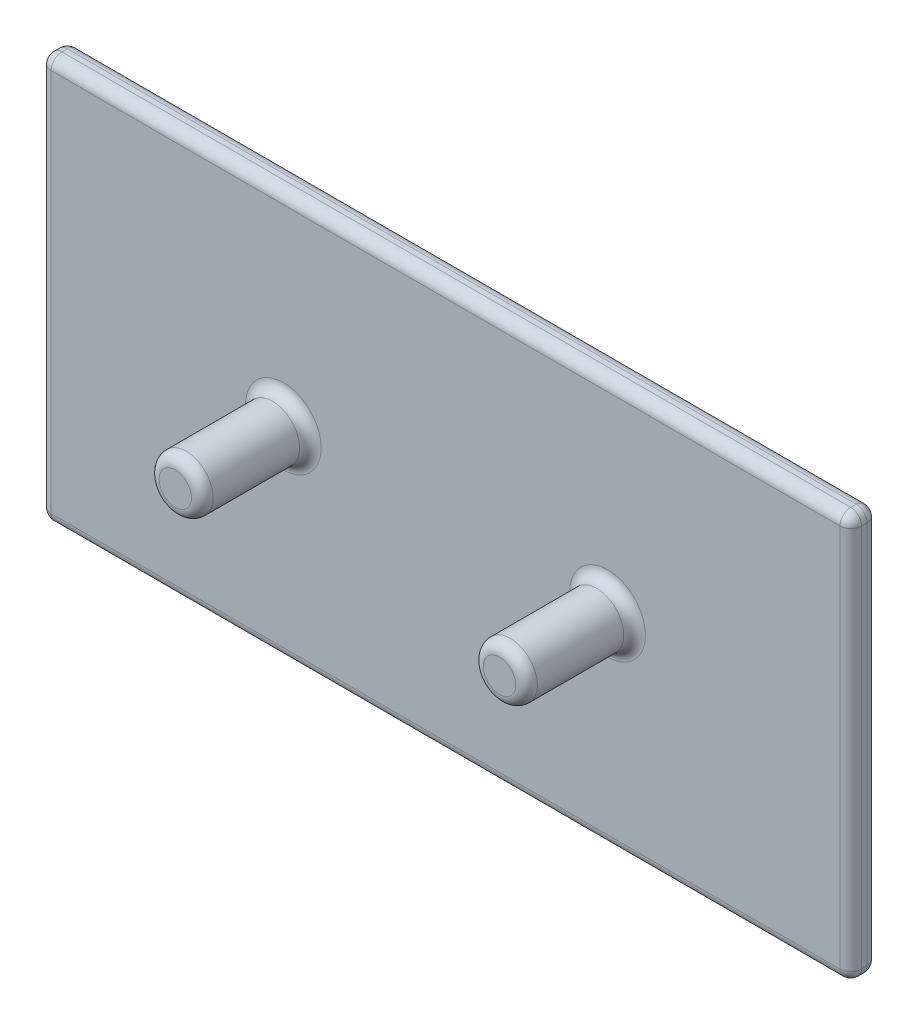
ISO-10303-21;
HEADER;
FILE_DESCRIPTION(('STEP AP214'),'2;1');
FILE_NAME('part.step','',(''),(''),'','','');
FILE_SCHEMA(('AUTOMOTIVE_DESIGN { 1 0 10303 214 1 1 1 1 }'));
ENDSEC;
DATA;
#1=APPLICATION_CONTEXT('core data for automotive mechanical design processes');
#2=APPLICATION_PROTOCOL_DEFINITION('international standard','automotive_design',2000,#1);
#3=PRODUCT_CONTEXT('',#1,'mechanical');
#4=PRODUCT('Part','Part','',(#3));
#5=PRODUCT_RELATED_PRODUCT_CATEGORY('part','',(#4));
#6=PRODUCT_DEFINITION_FORMATION('','',#4);
#7=PRODUCT_DEFINITION_CONTEXT('part definition',#1,'design');
#8=PRODUCT_DEFINITION('design','',#6,#7);
#9=PRODUCT_DEFINITION_SHAPE('','',#8);
#10=(LENGTH_UNIT() NAMED_UNIT(*) SI_UNIT(.MILLI.,.METRE.));
#11=(NAMED_UNIT(*) PLANE_ANGLE_UNIT() SI_UNIT($,.RADIAN.));
#12=(NAMED_UNIT(*) SI_UNIT($,.STERADIAN.) SOLID_ANGLE_UNIT());
#13=UNCERTAINTY_MEASURE_WITH_UNIT(LENGTH_MEASURE(1.E-05),#10,'distance_accuracy_value','');
#14=(GEOMETRIC_REPRESENTATION_CONTEXT(3) GLOBAL_UNCERTAINTY_ASSIGNED_CONTEXT((#13)) GLOBAL_UNIT_ASSIGNED_CONTEXT((#10,
#11,#12)) REPRESENTATION_CONTEXT('',''));
#15=CARTESIAN_POINT('',(0.,0.,0.));
#16=DIRECTION('',(0.,0.,1.));
#17=DIRECTION('',(1.,0.,0.));
#18=AXIS2_PLACEMENT_3D('',#15,#16,#17);
#19=CARTESIAN_POINT('',(0.,0.,10.));
#20=DIRECTION('',(1.,0.,0.));
#21=DIRECTION('',(0.,0.,-1.));
#22=AXIS2_PLACEMENT_3D('',#19,#20,#21);
#23=PLANE('',#22);
#24=DIRECTION('',(0.,0.,-1.));
#25=VECTOR('',#24,1.);
#26=CARTESIAN_POINT('',(0.,4.,10.));
#27=LINE('',#26,#25);
#28=CARTESIAN_POINT('',(0.,4.,4.));
#29=VERTEX_POINT('',#28);
#30=CARTESIAN_POINT('',(0.,4.,6.));
#31=VERTEX_POINT('',#30);
#32=EDGE_CURVE('E249',#29,#31,#27,.F.);
#33=ORIENTED_EDGE('',*,*,#32,.T.);
#34=DIRECTION('',(0.,-1.,0.));
#35=VECTOR('',#34,1.);
#36=CARTESIAN_POINT('',(0.,0.,6.));
#37=LINE('',#36,#35);
#38=CARTESIAN_POINT('',(0.,146.,6.));
#39=VERTEX_POINT('',#38);
#40=EDGE_CURVE('E251',#31,#39,#37,.F.);
#41=ORIENTED_EDGE('',*,*,#40,.T.);
#42=DIRECTION('',(0.,0.,-1.));
#43=VECTOR('',#42,1.);
#44=CARTESIAN_POINT('',(0.,146.,10.));
#45=LINE('',#44,#43);
#46=CARTESIAN_POINT('',(0.,146.,4.));
#47=VERTEX_POINT('',#46);
#48=EDGE_CURVE('E245',#39,#47,#45,.T.);
#49=ORIENTED_EDGE('',*,*,#48,.T.);
#50=DIRECTION('',(0.,-1.,0.));
#51=VECTOR('',#50,1.);
#52=CARTESIAN_POINT('',(0.,0.,4.));
#53=LINE('',#52,#51);
#54=EDGE_CURVE('E247',#47,#29,#53,.T.);
#55=ORIENTED_EDGE('',*,*,#54,.T.);
#56=EDGE_LOOP('',(#33,#41,#49,#55));
#57=FACE_BOUND('',#56,.T.);
#58=ADVANCED_FACE('F33',(#57),#23,.F.);
#59=CARTESIAN_POINT('',(0.,0.,10.));
#60=DIRECTION('',(0.,1.,0.));
#61=DIRECTION('',(0.,0.,1.));
#62=AXIS2_PLACEMENT_3D('',#59,#60,#61);
#63=PLANE('',#62);
#64=DIRECTION('',(1.,0.,0.));
#65=VECTOR('',#64,1.);
#66=CARTESIAN_POINT('',(0.,0.,6.));
#67=LINE('',#66,#65);
#68=CARTESIAN_POINT('',(296.,0.,6.));
#69=VERTEX_POINT('',#68);
#70=CARTESIAN_POINT('',(4.,0.,6.));
#71=VERTEX_POINT('',#70);
#72=EDGE_CURVE('E231',#69,#71,#67,.F.);
#73=ORIENTED_EDGE('',*,*,#72,.T.);
#74=DIRECTION('',(0.,0.,-1.));
#75=VECTOR('',#74,1.);
#76=CARTESIAN_POINT('',(4.,0.,10.));
#77=LINE('',#76,#75);
#78=CARTESIAN_POINT('',(4.,0.,4.));
#79=VERTEX_POINT('',#78);
#80=EDGE_CURVE('E234',#71,#79,#77,.T.);
#81=ORIENTED_EDGE('',*,*,#80,.T.);
#82=DIRECTION('',(1.,0.,0.));
#83=VECTOR('',#82,1.);
#84=CARTESIAN_POINT('',(300.,0.,4.));
#85=LINE('',#84,#83);
#86=CARTESIAN_POINT('',(296.,0.,4.));
#87=VERTEX_POINT('',#86);
#88=EDGE_CURVE('E229',#79,#87,#85,.T.);
#89=ORIENTED_EDGE('',*,*,#88,.T.);
#90=DIRECTION('',(0.,0.,-1.));
#91=VECTOR('',#90,1.);
#92=CARTESIAN_POINT('',(296.,0.,10.));
#93=LINE('',#92,#91);
#94=EDGE_CURVE('E227',#87,#69,#93,.F.);
#95=ORIENTED_EDGE('',*,*,#94,.T.);
#96=EDGE_LOOP('',(#73,#81,#89,#95));
#97=FACE_BOUND('',#96,.T.);
#98=ADVANCED_FACE('F296',(#97),#63,.F.);
#99=CARTESIAN_POINT('',(300.,0.,10.));
#100=DIRECTION('',(-1.,0.,0.));
#101=DIRECTION('',(0.,0.,1.));
#102=AXIS2_PLACEMENT_3D('',#99,#100,#101);
#103=PLANE('',#102);
#104=DIRECTION('',(0.,1.,0.));
#105=VECTOR('',#104,1.);
#106=CARTESIAN_POINT('',(300.,0.,6.));
#107=LINE('',#106,#105);
#108=CARTESIAN_POINT('',(300.,146.,6.));
#109=VERTEX_POINT('',#108);
#110=CARTESIAN_POINT('',(300.,4.,6.));
#111=VERTEX_POINT('',#110);
#112=EDGE_CURVE('E155',#109,#111,#107,.F.);
#113=ORIENTED_EDGE('',*,*,#112,.T.);
#114=DIRECTION('',(0.,0.,-1.));
#115=VECTOR('',#114,1.);
#116=CARTESIAN_POINT('',(300.,4.,10.));
#117=LINE('',#116,#115);
#118=CARTESIAN_POINT('',(300.,4.,4.));
#119=VERTEX_POINT('',#118);
#120=EDGE_CURVE('E259',#111,#119,#117,.T.);
#121=ORIENTED_EDGE('',*,*,#120,.T.);
#122=DIRECTION('',(0.,1.,0.));
#123=VECTOR('',#122,1.);
#124=CARTESIAN_POINT('',(300.,150.,4.));
#125=LINE('',#124,#123);
#126=CARTESIAN_POINT('',(300.,146.,4.));
#127=VERTEX_POINT('',#126);
#128=EDGE_CURVE('E256',#119,#127,#125,.T.);
#129=ORIENTED_EDGE('',*,*,#128,.T.);
#130=DIRECTION('',(0.,0.,-1.));
#131=VECTOR('',#130,1.);
#132=CARTESIAN_POINT('',(300.,146.,10.));
#133=LINE('',#132,#131);
#134=EDGE_CURVE('E254',#127,#109,#133,.F.);
#135=ORIENTED_EDGE('',*,*,#134,.T.);
#136=EDGE_LOOP('',(#113,#121,#129,#135));
#137=FACE_BOUND('',#136,.T.);
#138=ADVANCED_FACE('F309',(#137),#103,.F.);
#139=CARTESIAN_POINT('',(0.,150.,10.));
#140=DIRECTION('',(0.,-1.,0.));
#141=DIRECTION('',(0.,0.,-1.));
#142=AXIS2_PLACEMENT_3D('',#139,#140,#141);
#143=PLANE('',#142);
#144=DIRECTION('',(-1.,0.,0.));
#145=VECTOR('',#144,1.);
#146=CARTESIAN_POINT('',(0.,150.,6.));
#147=LINE('',#146,#145);
#148=CARTESIAN_POINT('',(4.,150.,6.));
#149=VERTEX_POINT('',#148);
#150=CARTESIAN_POINT('',(296.,150.,6.));
#151=VERTEX_POINT('',#150);
#152=EDGE_CURVE('E50',#149,#151,#147,.F.);
#153=ORIENTED_EDGE('',*,*,#152,.T.);
#154=DIRECTION('',(0.,0.,-1.));
#155=VECTOR('',#154,1.);
#156=CARTESIAN_POINT('',(296.,150.,10.));
#157=LINE('',#156,#155);
#158=CARTESIAN_POINT('',(296.,150.,4.));
#159=VERTEX_POINT('',#158);
#160=EDGE_CURVE('E266',#151,#159,#157,.T.);
#161=ORIENTED_EDGE('',*,*,#160,.T.);
#162=DIRECTION('',(-1.,0.,0.));
#163=VECTOR('',#162,1.);
#164=CARTESIAN_POINT('',(0.,150.,4.));
#165=LINE('',#164,#163);
#166=CARTESIAN_POINT('',(4.,150.,4.));
#167=VERTEX_POINT('',#166);
#168=EDGE_CURVE('E262',#159,#167,#165,.T.);
#169=ORIENTED_EDGE('',*,*,#168,.T.);
#170=DIRECTION('',(0.,0.,-1.));
#171=VECTOR('',#170,1.);
#172=CARTESIAN_POINT('',(4.,150.,10.));
#173=LINE('',#172,#171);
#174=EDGE_CURVE('E55',#167,#149,#173,.F.);
#175=ORIENTED_EDGE('',*,*,#174,.T.);
#176=EDGE_LOOP('',(#153,#161,#169,#175));
#177=FACE_BOUND('',#176,.T.);
#178=ADVANCED_FACE('F314',(#177),#143,.F.);
#179=CARTESIAN_POINT('',(0.,0.,10.));
#180=DIRECTION('',(0.,0.,-1.));
#181=DIRECTION('',(-1.,0.,0.));
#182=AXIS2_PLACEMENT_3D('',#179,#180,#181);
#183=PLANE('',#182);
#184=CARTESIAN_POINT('',(90.,75.,10.));
#185=DIRECTION('',(0.,0.,-1.));
#186=DIRECTION('',(-1.,0.,0.));
#187=AXIS2_PLACEMENT_3D('',#184,#185,#186);
#188=CIRCLE('',#187,14.);
#189=CARTESIAN_POINT('',(76.,75.,10.));
#190=VERTEX_POINT('',#189);
#191=EDGE_CURVE('E218',#190,#190,#188,.T.);
#192=ORIENTED_EDGE('',*,*,#191,.T.);
#193=EDGE_LOOP('',(#192));
#194=FACE_BOUND('',#193,.T.);
#195=CARTESIAN_POINT('',(210.,75.,10.));
#196=DIRECTION('',(0.,0.,-1.));
#197=DIRECTION('',(-1.,0.,0.));
#198=AXIS2_PLACEMENT_3D('',#195,#196,#197);
#199=CIRCLE('',#198,14.);
#200=CARTESIAN_POINT('',(196.,75.,10.));
#201=VERTEX_POINT('',#200);
#202=EDGE_CURVE('E215',#201,#201,#199,.T.);
#203=ORIENTED_EDGE('',*,*,#202,.T.);
#204=EDGE_LOOP('',(#203));
#205=FACE_BOUND('',#204,.T.);
#206=DIRECTION('',(0.,-1.,0.));
#207=VECTOR('',#206,1.);
#208=CARTESIAN_POINT('',(4.,0.,10.));
#209=LINE('',#208,#207);
#210=CARTESIAN_POINT('',(4.,146.,10.));
#211=VERTEX_POINT('',#210);
#212=CARTESIAN_POINT('',(4.,4.,10.));
#213=VERTEX_POINT('',#212);
#214=EDGE_CURVE('E133',#211,#213,#209,.T.);
#215=ORIENTED_EDGE('',*,*,#214,.T.);
#216=DIRECTION('',(1.,0.,0.));
#217=VECTOR('',#216,1.);
#218=CARTESIAN_POINT('',(0.,4.,10.));
#219=LINE('',#218,#217);
#220=CARTESIAN_POINT('',(296.,4.,10.));
#221=VERTEX_POINT('',#220);
#222=EDGE_CURVE('E129',#213,#221,#219,.T.);
#223=ORIENTED_EDGE('',*,*,#222,.T.);
#224=DIRECTION('',(0.,1.,0.));
#225=VECTOR('',#224,1.);
#226=CARTESIAN_POINT('',(296.,0.,10.));
#227=LINE('',#226,#225);
#228=CARTESIAN_POINT('',(296.,146.,10.));
#229=VERTEX_POINT('',#228);
#230=EDGE_CURVE('E123',#221,#229,#227,.T.);
#231=ORIENTED_EDGE('',*,*,#230,.T.);
#232=DIRECTION('',(-1.,0.,0.));
#233=VECTOR('',#232,1.);
#234=CARTESIAN_POINT('',(0.,146.,10.));
#235=LINE('',#234,#233);
#236=EDGE_CURVE('E126',#229,#211,#235,.T.);
#237=ORIENTED_EDGE('',*,*,#236,.T.);
#238=EDGE_LOOP('',(#215,#223,#231,#237));
#239=FACE_BOUND('',#238,.T.);
#240=ADVANCED_FACE('F125',(#194,#205,#239),#183,.F.);
#241=CARTESIAN_POINT('',(0.,0.,0.));
#242=DIRECTION('',(0.,0.,-1.));
#243=DIRECTION('',(-1.,0.,0.));
#244=AXIS2_PLACEMENT_3D('',#241,#242,#243);
#245=PLANE('',#244);
#246=DIRECTION('',(0.,1.,0.));
#247=VECTOR('',#246,1.);
#248=CARTESIAN_POINT('',(296.,0.,0.));
#249=LINE('',#248,#247);
#250=CARTESIAN_POINT('',(296.,146.,0.));
#251=VERTEX_POINT('',#250);
#252=CARTESIAN_POINT('',(296.,4.,0.));
#253=VERTEX_POINT('',#252);
#254=EDGE_CURVE('E238',#251,#253,#249,.F.);
#255=ORIENTED_EDGE('',*,*,#254,.T.);
#256=DIRECTION('',(1.,0.,0.));
#257=VECTOR('',#256,1.);
#258=CARTESIAN_POINT('',(0.,4.,0.));
#259=LINE('',#258,#257);
#260=CARTESIAN_POINT('',(4.,4.,0.));
#261=VERTEX_POINT('',#260);
#262=EDGE_CURVE('E242',#253,#261,#259,.F.);
#263=ORIENTED_EDGE('',*,*,#262,.T.);
#264=DIRECTION('',(0.,-1.,0.));
#265=VECTOR('',#264,1.);
#266=CARTESIAN_POINT('',(4.,150.,0.));
#267=LINE('',#266,#265);
#268=CARTESIAN_POINT('',(4.,146.,0.));
#269=VERTEX_POINT('',#268);
#270=EDGE_CURVE('E240',#261,#269,#267,.F.);
#271=ORIENTED_EDGE('',*,*,#270,.T.);
#272=DIRECTION('',(-1.,0.,0.));
#273=VECTOR('',#272,1.);
#274=CARTESIAN_POINT('',(300.,146.,0.));
#275=LINE('',#274,#273);
#276=EDGE_CURVE('E236',#269,#251,#275,.F.);
#277=ORIENTED_EDGE('',*,*,#276,.T.);
#278=EDGE_LOOP('',(#255,#263,#271,#277));
#279=FACE_BOUND('',#278,.T.);
#280=ADVANCED_FACE('F583',(#279),#245,.T.);
#281=CARTESIAN_POINT('',(90.,75.,50.));
#282=DIRECTION('',(0.,0.,-1.));
#283=DIRECTION('',(-1.,0.,0.));
#284=AXIS2_PLACEMENT_3D('',#281,#282,#283);
#285=CYLINDRICAL_SURFACE('',#284,9.99999999999999);
#286=CARTESIAN_POINT('',(90.,75.,14.));
#287=DIRECTION('',(0.,0.,-1.));
#288=DIRECTION('',(-1.,0.,0.));
#289=AXIS2_PLACEMENT_3D('',#286,#287,#288);
#290=CIRCLE('',#289,9.99999999999999);
#291=CARTESIAN_POINT('',(80.,75.,14.));
#292=VERTEX_POINT('',#291);
#293=EDGE_CURVE('E144',#292,#292,#290,.F.);
#294=ORIENTED_EDGE('',*,*,#293,.T.);
#295=EDGE_LOOP('',(#294));
#296=FACE_BOUND('',#295,.T.);
#297=CARTESIAN_POINT('',(90.,75.,46.));
#298=DIRECTION('',(0.,0.,1.));
#299=DIRECTION('',(1.,0.,0.));
#300=AXIS2_PLACEMENT_3D('',#297,#298,#299);
#301=CIRCLE('',#300,9.99999999999999);
#302=CARTESIAN_POINT('',(100.,75.,46.));
#303=VERTEX_POINT('',#302);
#304=EDGE_CURVE('E201',#303,#303,#301,.F.);
#305=ORIENTED_EDGE('',*,*,#304,.T.);
#306=EDGE_LOOP('',(#305));
#307=FACE_BOUND('',#306,.T.);
#308=ADVANCED_FACE('F574',(#296,#307),#285,.T.);
#309=CARTESIAN_POINT('',(90.,75.,50.));
#310=DIRECTION('',(0.,0.,1.));
#311=DIRECTION('',(1.,0.,0.));
#312=AXIS2_PLACEMENT_3D('',#309,#310,#311);
#313=PLANE('',#312);
#314=CARTESIAN_POINT('',(90.,75.,50.));
#315=DIRECTION('',(0.,0.,1.));
#316=DIRECTION('',(1.,0.,0.));
#317=AXIS2_PLACEMENT_3D('',#314,#315,#316);
#318=CIRCLE('',#317,5.99999999999999);
#319=CARTESIAN_POINT('',(96.,75.,50.));
#320=VERTEX_POINT('',#319);
#321=EDGE_CURVE('E11',#320,#320,#318,.T.);
#322=ORIENTED_EDGE('',*,*,#321,.T.);
#323=EDGE_LOOP('',(#322));
#324=FACE_BOUND('',#323,.T.);
#325=ADVANCED_FACE('F565',(#324),#313,.T.);
#326=CARTESIAN_POINT('',(210.,75.,50.));
#327=DIRECTION('',(0.,0.,-1.));
#328=DIRECTION('',(-1.,0.,0.));
#329=AXIS2_PLACEMENT_3D('',#326,#327,#328);
#330=CYLINDRICAL_SURFACE('',#329,10.);
#331=CARTESIAN_POINT('',(210.,75.,14.));
#332=DIRECTION('',(0.,0.,-1.));
#333=DIRECTION('',(-1.,0.,0.));
#334=AXIS2_PLACEMENT_3D('',#331,#332,#333);
#335=CIRCLE('',#334,10.);
#336=CARTESIAN_POINT('',(200.,75.,14.));
#337=VERTEX_POINT('',#336);
#338=EDGE_CURVE('E224',#337,#337,#335,.F.);
#339=ORIENTED_EDGE('',*,*,#338,.T.);
#340=EDGE_LOOP('',(#339));
#341=FACE_BOUND('',#340,.T.);
#342=CARTESIAN_POINT('',(210.,75.,46.));
#343=DIRECTION('',(0.,0.,1.));
#344=DIRECTION('',(1.,0.,0.));
#345=AXIS2_PLACEMENT_3D('',#342,#343,#344);
#346=CIRCLE('',#345,10.);
#347=CARTESIAN_POINT('',(220.,75.,46.));
#348=VERTEX_POINT('',#347);
#349=EDGE_CURVE('E221',#348,#348,#346,.F.);
#350=ORIENTED_EDGE('',*,*,#349,.T.);
#351=EDGE_LOOP('',(#350));
#352=FACE_BOUND('',#351,.T.);
#353=ADVANCED_FACE('F556',(#341,#352),#330,.T.);
#354=CARTESIAN_POINT('',(210.,75.,50.));
#355=DIRECTION('',(0.,0.,1.));
#356=DIRECTION('',(1.,0.,0.));
#357=AXIS2_PLACEMENT_3D('',#354,#355,#356);
#358=PLANE('',#357);
#359=CARTESIAN_POINT('',(210.,75.,50.));
#360=DIRECTION('',(0.,0.,1.));
#361=DIRECTION('',(1.,0.,0.));
#362=AXIS2_PLACEMENT_3D('',#359,#360,#361);
#363=CIRCLE('',#362,6.00000000000001);
#364=CARTESIAN_POINT('',(216.,75.,50.));
#365=VERTEX_POINT('',#364);
#366=EDGE_CURVE('E42',#365,#365,#363,.T.);
#367=ORIENTED_EDGE('',*,*,#366,.T.);
#368=EDGE_LOOP('',(#367));
#369=FACE_BOUND('',#368,.T.);
#370=ADVANCED_FACE('F369',(#369),#358,.T.);
#371=CARTESIAN_POINT('',(90.,75.,14.));
#372=DIRECTION('',(0.,0.,-1.));
#373=DIRECTION('',(-1.,0.,0.));
#374=AXIS2_PLACEMENT_3D('',#371,#372,#373);
#375=TOROIDAL_SURFACE('',#374,14.,4.);
#376=ORIENTED_EDGE('',*,*,#191,.F.);
#377=EDGE_LOOP('',(#376));
#378=FACE_BOUND('',#377,.T.);
#379=ORIENTED_EDGE('',*,*,#293,.F.);
#380=EDGE_LOOP('',(#379));
#381=FACE_BOUND('',#380,.T.);
#382=ADVANCED_FACE('F365',(#378,#381),#375,.F.);
#383=CARTESIAN_POINT('',(210.,75.,14.));
#384=DIRECTION('',(0.,0.,-1.));
#385=DIRECTION('',(-1.,0.,0.));
#386=AXIS2_PLACEMENT_3D('',#383,#384,#385);
#387=TOROIDAL_SURFACE('',#386,14.,4.);
#388=ORIENTED_EDGE('',*,*,#202,.F.);
#389=EDGE_LOOP('',(#388));
#390=FACE_BOUND('',#389,.T.);
#391=ORIENTED_EDGE('',*,*,#338,.F.);
#392=EDGE_LOOP('',(#391));
#393=FACE_BOUND('',#392,.T.);
#394=ADVANCED_FACE('F368',(#390,#393),#387,.F.);
#395=CARTESIAN_POINT('',(0.,146.,4.));
#396=DIRECTION('',(1.,0.,0.));
#397=DIRECTION('',(0.,0.,-1.));
#398=AXIS2_PLACEMENT_3D('',#395,#396,#397);
#399=CYLINDRICAL_SURFACE('',#398,4.);
#400=CARTESIAN_POINT('',(4.,146.,4.));
#401=DIRECTION('',(-1.,0.,0.));
#402=DIRECTION('',(0.,0.,1.));
#403=AXIS2_PLACEMENT_3D('',#400,#401,#402);
#404=CIRCLE('',#403,4.);
#405=EDGE_CURVE('E37',#167,#269,#404,.T.);
#406=ORIENTED_EDGE('',*,*,#405,.F.);
#407=ORIENTED_EDGE('',*,*,#168,.F.);
#408=CARTESIAN_POINT('',(296.,146.,4.));
#409=DIRECTION('',(1.,0.,0.));
#410=DIRECTION('',(0.,0.,-1.));
#411=AXIS2_PLACEMENT_3D('',#408,#409,#410);
#412=CIRCLE('',#411,4.);
#413=EDGE_CURVE('E193',#251,#159,#412,.T.);
#414=ORIENTED_EDGE('',*,*,#413,.F.);
#415=ORIENTED_EDGE('',*,*,#276,.F.);
#416=EDGE_LOOP('',(#406,#407,#414,#415));
#417=FACE_BOUND('',#416,.T.);
#418=ADVANCED_FACE('F317',(#417),#399,.T.);
#419=CARTESIAN_POINT('',(4.,146.,4.));
#420=DIRECTION('',(0.,0.,1.));
#421=DIRECTION('',(1.,0.,0.));
#422=AXIS2_PLACEMENT_3D('',#419,#420,#421);
#423=SPHERICAL_SURFACE('',#422,4.);
#424=CARTESIAN_POINT('',(4.,146.,4.));
#425=DIRECTION('',(0.,0.,-1.));
#426=DIRECTION('',(-1.,0.,0.));
#427=AXIS2_PLACEMENT_3D('',#424,#425,#426);
#428=CIRCLE('',#427,4.);
#429=EDGE_CURVE('E188',#167,#47,#428,.F.);
#430=ORIENTED_EDGE('',*,*,#429,.F.);
#431=ORIENTED_EDGE('',*,*,#405,.T.);
#432=CARTESIAN_POINT('',(4.,146.,4.));
#433=DIRECTION('',(0.,1.,0.));
#434=DIRECTION('',(0.,0.,1.));
#435=AXIS2_PLACEMENT_3D('',#432,#433,#434);
#436=CIRCLE('',#435,4.);
#437=EDGE_CURVE('E191',#47,#269,#436,.F.);
#438=ORIENTED_EDGE('',*,*,#437,.F.);
#439=EDGE_LOOP('',(#430,#431,#438));
#440=FACE_BOUND('',#439,.T.);
#441=ADVANCED_FACE('F318',(#440),#423,.T.);
#442=CARTESIAN_POINT('',(296.,146.,4.));
#443=DIRECTION('',(0.,0.,1.));
#444=DIRECTION('',(1.,0.,0.));
#445=AXIS2_PLACEMENT_3D('',#442,#443,#444);
#446=SPHERICAL_SURFACE('',#445,4.);
#447=CARTESIAN_POINT('',(296.,146.,4.));
#448=DIRECTION('',(0.,1.,0.));
#449=DIRECTION('',(0.,0.,1.));
#450=AXIS2_PLACEMENT_3D('',#447,#448,#449);
#451=CIRCLE('',#450,4.);
#452=EDGE_CURVE('E183',#251,#127,#451,.F.);
#453=ORIENTED_EDGE('',*,*,#452,.F.);
#454=ORIENTED_EDGE('',*,*,#413,.T.);
#455=CARTESIAN_POINT('',(296.,146.,4.));
#456=DIRECTION('',(0.,0.,-1.));
#457=DIRECTION('',(-1.,0.,0.));
#458=AXIS2_PLACEMENT_3D('',#455,#456,#457);
#459=CIRCLE('',#458,4.);
#460=EDGE_CURVE('E186',#127,#159,#459,.F.);
#461=ORIENTED_EDGE('',*,*,#460,.F.);
#462=EDGE_LOOP('',(#453,#454,#461));
#463=FACE_BOUND('',#462,.T.);
#464=ADVANCED_FACE('F348',(#463),#446,.T.);
#465=CARTESIAN_POINT('',(4.,0.,4.));
#466=DIRECTION('',(0.,1.,0.));
#467=DIRECTION('',(0.,0.,1.));
#468=AXIS2_PLACEMENT_3D('',#465,#466,#467);
#469=CYLINDRICAL_SURFACE('',#468,4.);
#470=ORIENTED_EDGE('',*,*,#437,.T.);
#471=ORIENTED_EDGE('',*,*,#270,.F.);
#472=CARTESIAN_POINT('',(4.,4.,4.));
#473=DIRECTION('',(0.,-1.,0.));
#474=DIRECTION('',(0.,0.,-1.));
#475=AXIS2_PLACEMENT_3D('',#472,#473,#474);
#476=CIRCLE('',#475,4.);
#477=EDGE_CURVE('E178',#29,#261,#476,.T.);
#478=ORIENTED_EDGE('',*,*,#477,.F.);
#479=ORIENTED_EDGE('',*,*,#54,.F.);
#480=EDGE_LOOP('',(#470,#471,#478,#479));
#481=FACE_BOUND('',#480,.T.);
#482=ADVANCED_FACE('F334',(#481),#469,.T.);
#483=CARTESIAN_POINT('',(4.,146.,10.));
#484=DIRECTION('',(0.,0.,-1.));
#485=DIRECTION('',(-1.,0.,0.));
#486=AXIS2_PLACEMENT_3D('',#483,#484,#485);
#487=CYLINDRICAL_SURFACE('',#486,4.);
#488=ORIENTED_EDGE('',*,*,#429,.T.);
#489=ORIENTED_EDGE('',*,*,#48,.F.);
#490=CARTESIAN_POINT('',(4.,146.,6.));
#491=DIRECTION('',(0.,0.,1.));
#492=DIRECTION('',(1.,0.,0.));
#493=AXIS2_PLACEMENT_3D('',#490,#491,#492);
#494=CIRCLE('',#493,4.);
#495=EDGE_CURVE('E175',#149,#39,#494,.T.);
#496=ORIENTED_EDGE('',*,*,#495,.F.);
#497=ORIENTED_EDGE('',*,*,#174,.F.);
#498=EDGE_LOOP('',(#488,#489,#496,#497));
#499=FACE_BOUND('',#498,.T.);
#500=ADVANCED_FACE('F323',(#499),#487,.T.);
#501=CARTESIAN_POINT('',(0.,146.,6.));
#502=DIRECTION('',(-1.,0.,0.));
#503=DIRECTION('',(0.,0.,1.));
#504=AXIS2_PLACEMENT_3D('',#501,#502,#503);
#505=CYLINDRICAL_SURFACE('',#504,4.);
#506=CARTESIAN_POINT('',(296.,146.,6.));
#507=DIRECTION('',(1.,0.,0.));
#508=DIRECTION('',(0.,0.,-1.));
#509=AXIS2_PLACEMENT_3D('',#506,#507,#508);
#510=CIRCLE('',#509,4.);
#511=EDGE_CURVE('E139',#151,#229,#510,.T.);
#512=ORIENTED_EDGE('',*,*,#511,.F.);
#513=ORIENTED_EDGE('',*,*,#152,.F.);
#514=CARTESIAN_POINT('',(4.,146.,6.));
#515=DIRECTION('',(-1.,0.,0.));
#516=DIRECTION('',(0.,0.,1.));
#517=AXIS2_PLACEMENT_3D('',#514,#515,#516);
#518=CIRCLE('',#517,4.);
#519=EDGE_CURVE('E142',#211,#149,#518,.T.);
#520=ORIENTED_EDGE('',*,*,#519,.F.);
#521=ORIENTED_EDGE('',*,*,#236,.F.);
#522=EDGE_LOOP('',(#512,#513,#520,#521));
#523=FACE_BOUND('',#522,.T.);
#524=ADVANCED_FACE('F138',(#523),#505,.T.);
#525=CARTESIAN_POINT('',(296.,146.,10.));
#526=DIRECTION('',(0.,0.,-1.));
#527=DIRECTION('',(-1.,0.,0.));
#528=AXIS2_PLACEMENT_3D('',#525,#526,#527);
#529=CYLINDRICAL_SURFACE('',#528,4.);
#530=ORIENTED_EDGE('',*,*,#460,.T.);
#531=ORIENTED_EDGE('',*,*,#160,.F.);
#532=CARTESIAN_POINT('',(296.,146.,6.));
#533=DIRECTION('',(0.,0.,1.));
#534=DIRECTION('',(1.,0.,0.));
#535=AXIS2_PLACEMENT_3D('',#532,#533,#534);
#536=CIRCLE('',#535,4.);
#537=EDGE_CURVE('E152',#109,#151,#536,.T.);
#538=ORIENTED_EDGE('',*,*,#537,.F.);
#539=ORIENTED_EDGE('',*,*,#134,.F.);
#540=EDGE_LOOP('',(#530,#531,#538,#539));
#541=FACE_BOUND('',#540,.T.);
#542=ADVANCED_FACE('F313',(#541),#529,.T.);
#543=CARTESIAN_POINT('',(296.,0.,4.));
#544=DIRECTION('',(0.,-1.,0.));
#545=DIRECTION('',(0.,0.,-1.));
#546=AXIS2_PLACEMENT_3D('',#543,#544,#545);
#547=CYLINDRICAL_SURFACE('',#546,4.);
#548=ORIENTED_EDGE('',*,*,#452,.T.);
#549=ORIENTED_EDGE('',*,*,#128,.F.);
#550=CARTESIAN_POINT('',(296.,4.,4.));
#551=DIRECTION('',(0.,-1.,0.));
#552=DIRECTION('',(0.,0.,-1.));
#553=AXIS2_PLACEMENT_3D('',#550,#551,#552);
#554=CIRCLE('',#553,4.);
#555=EDGE_CURVE('E170',#253,#119,#554,.T.);
#556=ORIENTED_EDGE('',*,*,#555,.F.);
#557=ORIENTED_EDGE('',*,*,#254,.F.);
#558=EDGE_LOOP('',(#548,#549,#556,#557));
#559=FACE_BOUND('',#558,.T.);
#560=ADVANCED_FACE('F347',(#559),#547,.T.);
#561=CARTESIAN_POINT('',(0.,4.,4.));
#562=DIRECTION('',(-1.,0.,0.));
#563=DIRECTION('',(0.,0.,1.));
#564=AXIS2_PLACEMENT_3D('',#561,#562,#563);
#565=CYLINDRICAL_SURFACE('',#564,4.);
#566=CARTESIAN_POINT('',(4.,4.,4.));
#567=DIRECTION('',(-1.,0.,0.));
#568=DIRECTION('',(0.,0.,1.));
#569=AXIS2_PLACEMENT_3D('',#566,#567,#568);
#570=CIRCLE('',#569,4.);
#571=EDGE_CURVE('E180',#261,#79,#570,.T.);
#572=ORIENTED_EDGE('',*,*,#571,.F.);
#573=ORIENTED_EDGE('',*,*,#262,.F.);
#574=CARTESIAN_POINT('',(296.,4.,4.));
#575=DIRECTION('',(1.,0.,0.));
#576=DIRECTION('',(0.,0.,-1.));
#577=AXIS2_PLACEMENT_3D('',#574,#575,#576);
#578=CIRCLE('',#577,4.);
#579=EDGE_CURVE('E167',#87,#253,#578,.T.);
#580=ORIENTED_EDGE('',*,*,#579,.F.);
#581=ORIENTED_EDGE('',*,*,#88,.F.);
#582=EDGE_LOOP('',(#572,#573,#580,#581));
#583=FACE_BOUND('',#582,.T.);
#584=ADVANCED_FACE('F340',(#583),#565,.T.);
#585=CARTESIAN_POINT('',(4.,4.,4.));
#586=DIRECTION('',(0.,0.,1.));
#587=DIRECTION('',(1.,0.,0.));
#588=AXIS2_PLACEMENT_3D('',#585,#586,#587);
#589=SPHERICAL_SURFACE('',#588,4.);
#590=ORIENTED_EDGE('',*,*,#477,.T.);
#591=ORIENTED_EDGE('',*,*,#571,.T.);
#592=CARTESIAN_POINT('',(4.,4.,4.));
#593=DIRECTION('',(0.,0.,-1.));
#594=DIRECTION('',(-1.,0.,0.));
#595=AXIS2_PLACEMENT_3D('',#592,#593,#594);
#596=CIRCLE('',#595,4.);
#597=EDGE_CURVE('E159',#29,#79,#596,.F.);
#598=ORIENTED_EDGE('',*,*,#597,.F.);
#599=EDGE_LOOP('',(#590,#591,#598));
#600=FACE_BOUND('',#599,.T.);
#601=ADVANCED_FACE('F337',(#600),#589,.T.);
#602=CARTESIAN_POINT('',(4.,146.,6.));
#603=DIRECTION('',(0.,0.,1.));
#604=DIRECTION('',(1.,0.,0.));
#605=AXIS2_PLACEMENT_3D('',#602,#603,#604);
#606=SPHERICAL_SURFACE('',#605,4.);
#607=ORIENTED_EDGE('',*,*,#519,.T.);
#608=ORIENTED_EDGE('',*,*,#495,.T.);
#609=CARTESIAN_POINT('',(4.,146.,6.));
#610=DIRECTION('',(0.,1.,0.));
#611=DIRECTION('',(0.,0.,1.));
#612=AXIS2_PLACEMENT_3D('',#609,#610,#611);
#613=CIRCLE('',#612,4.);
#614=EDGE_CURVE('E156',#211,#39,#613,.F.);
#615=ORIENTED_EDGE('',*,*,#614,.F.);
#616=EDGE_LOOP('',(#607,#608,#615));
#617=FACE_BOUND('',#616,.T.);
#618=ADVANCED_FACE('F325',(#617),#606,.T.);
#619=CARTESIAN_POINT('',(296.,146.,6.));
#620=DIRECTION('',(0.,0.,1.));
#621=DIRECTION('',(1.,0.,0.));
#622=AXIS2_PLACEMENT_3D('',#619,#620,#621);
#623=SPHERICAL_SURFACE('',#622,4.);
#624=ORIENTED_EDGE('',*,*,#537,.T.);
#625=ORIENTED_EDGE('',*,*,#511,.T.);
#626=CARTESIAN_POINT('',(296.,146.,6.));
#627=DIRECTION('',(0.,1.,0.));
#628=DIRECTION('',(0.,0.,1.));
#629=AXIS2_PLACEMENT_3D('',#626,#627,#628);
#630=CIRCLE('',#629,4.);
#631=EDGE_CURVE('E149',#109,#229,#630,.F.);
#632=ORIENTED_EDGE('',*,*,#631,.F.);
#633=EDGE_LOOP('',(#624,#625,#632));
#634=FACE_BOUND('',#633,.T.);
#635=ADVANCED_FACE('F148',(#634),#623,.T.);
#636=CARTESIAN_POINT('',(296.,4.,4.));
#637=DIRECTION('',(0.,0.,1.));
#638=DIRECTION('',(1.,0.,0.));
#639=AXIS2_PLACEMENT_3D('',#636,#637,#638);
#640=SPHERICAL_SURFACE('',#639,4.);
#641=ORIENTED_EDGE('',*,*,#579,.T.);
#642=ORIENTED_EDGE('',*,*,#555,.T.);
#643=CARTESIAN_POINT('',(296.,4.,4.));
#644=DIRECTION('',(0.,0.,-1.));
#645=DIRECTION('',(-1.,0.,0.));
#646=AXIS2_PLACEMENT_3D('',#643,#644,#645);
#647=CIRCLE('',#646,4.);
#648=EDGE_CURVE('E157',#87,#119,#647,.F.);
#649=ORIENTED_EDGE('',*,*,#648,.F.);
#650=EDGE_LOOP('',(#641,#642,#649));
#651=FACE_BOUND('',#650,.T.);
#652=ADVANCED_FACE('F344',(#651),#640,.T.);
#653=CARTESIAN_POINT('',(4.,4.,10.));
#654=DIRECTION('',(0.,0.,-1.));
#655=DIRECTION('',(-1.,0.,0.));
#656=AXIS2_PLACEMENT_3D('',#653,#654,#655);
#657=CYLINDRICAL_SURFACE('',#656,4.);
#658=ORIENTED_EDGE('',*,*,#597,.T.);
#659=ORIENTED_EDGE('',*,*,#80,.F.);
#660=CARTESIAN_POINT('',(4.,4.,6.));
#661=DIRECTION('',(0.,0.,1.));
#662=DIRECTION('',(1.,0.,0.));
#663=AXIS2_PLACEMENT_3D('',#660,#661,#662);
#664=CIRCLE('',#663,4.);
#665=EDGE_CURVE('E161',#31,#71,#664,.T.);
#666=ORIENTED_EDGE('',*,*,#665,.F.);
#667=ORIENTED_EDGE('',*,*,#32,.F.);
#668=EDGE_LOOP('',(#658,#659,#666,#667));
#669=FACE_BOUND('',#668,.T.);
#670=ADVANCED_FACE('F291',(#669),#657,.T.);
#671=CARTESIAN_POINT('',(4.,0.,6.));
#672=DIRECTION('',(0.,-1.,0.));
#673=DIRECTION('',(0.,0.,-1.));
#674=AXIS2_PLACEMENT_3D('',#671,#672,#673);
#675=CYLINDRICAL_SURFACE('',#674,4.);
#676=ORIENTED_EDGE('',*,*,#614,.T.);
#677=ORIENTED_EDGE('',*,*,#40,.F.);
#678=CARTESIAN_POINT('',(4.,4.,6.));
#679=DIRECTION('',(0.,-1.,0.));
#680=DIRECTION('',(0.,0.,-1.));
#681=AXIS2_PLACEMENT_3D('',#678,#679,#680);
#682=CIRCLE('',#681,4.);
#683=EDGE_CURVE('E280',#213,#31,#682,.T.);
#684=ORIENTED_EDGE('',*,*,#683,.F.);
#685=ORIENTED_EDGE('',*,*,#214,.F.);
#686=EDGE_LOOP('',(#676,#677,#684,#685));
#687=FACE_BOUND('',#686,.T.);
#688=ADVANCED_FACE('F329',(#687),#675,.T.);
#689=CARTESIAN_POINT('',(296.,0.,6.));
#690=DIRECTION('',(0.,1.,0.));
#691=DIRECTION('',(0.,0.,1.));
#692=AXIS2_PLACEMENT_3D('',#689,#690,#691);
#693=CYLINDRICAL_SURFACE('',#692,4.);
#694=ORIENTED_EDGE('',*,*,#631,.T.);
#695=ORIENTED_EDGE('',*,*,#230,.F.);
#696=CARTESIAN_POINT('',(296.,4.,6.));
#697=DIRECTION('',(0.,-1.,0.));
#698=DIRECTION('',(0.,0.,-1.));
#699=AXIS2_PLACEMENT_3D('',#696,#697,#698);
#700=CIRCLE('',#699,4.);
#701=EDGE_CURVE('E277',#111,#221,#700,.T.);
#702=ORIENTED_EDGE('',*,*,#701,.F.);
#703=ORIENTED_EDGE('',*,*,#112,.F.);
#704=EDGE_LOOP('',(#694,#695,#702,#703));
#705=FACE_BOUND('',#704,.T.);
#706=ADVANCED_FACE('F154',(#705),#693,.T.);
#707=CARTESIAN_POINT('',(296.,4.,10.));
#708=DIRECTION('',(0.,0.,-1.));
#709=DIRECTION('',(-1.,0.,0.));
#710=AXIS2_PLACEMENT_3D('',#707,#708,#709);
#711=CYLINDRICAL_SURFACE('',#710,4.);
#712=ORIENTED_EDGE('',*,*,#648,.T.);
#713=ORIENTED_EDGE('',*,*,#120,.F.);
#714=CARTESIAN_POINT('',(296.,4.,6.));
#715=DIRECTION('',(0.,0.,1.));
#716=DIRECTION('',(1.,0.,0.));
#717=AXIS2_PLACEMENT_3D('',#714,#715,#716);
#718=CIRCLE('',#717,4.);
#719=EDGE_CURVE('E274',#69,#111,#718,.T.);
#720=ORIENTED_EDGE('',*,*,#719,.F.);
#721=ORIENTED_EDGE('',*,*,#94,.F.);
#722=EDGE_LOOP('',(#712,#713,#720,#721));
#723=FACE_BOUND('',#722,.T.);
#724=ADVANCED_FACE('F306',(#723),#711,.T.);
#725=CARTESIAN_POINT('',(4.,4.,6.));
#726=DIRECTION('',(0.,0.,1.));
#727=DIRECTION('',(1.,0.,0.));
#728=AXIS2_PLACEMENT_3D('',#725,#726,#727);
#729=SPHERICAL_SURFACE('',#728,4.);
#730=ORIENTED_EDGE('',*,*,#683,.T.);
#731=ORIENTED_EDGE('',*,*,#665,.T.);
#732=CARTESIAN_POINT('',(4.,4.,6.));
#733=DIRECTION('',(-1.,0.,0.));
#734=DIRECTION('',(0.,0.,1.));
#735=AXIS2_PLACEMENT_3D('',#732,#733,#734);
#736=CIRCLE('',#735,4.);
#737=EDGE_CURVE('E272',#213,#71,#736,.F.);
#738=ORIENTED_EDGE('',*,*,#737,.F.);
#739=EDGE_LOOP('',(#730,#731,#738));
#740=FACE_BOUND('',#739,.T.);
#741=ADVANCED_FACE('F287',(#740),#729,.T.);
#742=CARTESIAN_POINT('',(296.,4.,6.));
#743=DIRECTION('',(0.,0.,1.));
#744=DIRECTION('',(1.,0.,0.));
#745=AXIS2_PLACEMENT_3D('',#742,#743,#744);
#746=SPHERICAL_SURFACE('',#745,4.);
#747=ORIENTED_EDGE('',*,*,#719,.T.);
#748=ORIENTED_EDGE('',*,*,#701,.T.);
#749=CARTESIAN_POINT('',(296.,4.,6.));
#750=DIRECTION('',(1.,0.,0.));
#751=DIRECTION('',(0.,0.,-1.));
#752=AXIS2_PLACEMENT_3D('',#749,#750,#751);
#753=CIRCLE('',#752,4.);
#754=EDGE_CURVE('E270',#69,#221,#753,.F.);
#755=ORIENTED_EDGE('',*,*,#754,.F.);
#756=EDGE_LOOP('',(#747,#748,#755));
#757=FACE_BOUND('',#756,.T.);
#758=ADVANCED_FACE('F303',(#757),#746,.T.);
#759=CARTESIAN_POINT('',(0.,4.,6.));
#760=DIRECTION('',(1.,0.,0.));
#761=DIRECTION('',(0.,0.,-1.));
#762=AXIS2_PLACEMENT_3D('',#759,#760,#761);
#763=CYLINDRICAL_SURFACE('',#762,4.);
#764=ORIENTED_EDGE('',*,*,#737,.T.);
#765=ORIENTED_EDGE('',*,*,#72,.F.);
#766=ORIENTED_EDGE('',*,*,#754,.T.);
#767=ORIENTED_EDGE('',*,*,#222,.F.);
#768=EDGE_LOOP('',(#764,#765,#766,#767));
#769=FACE_BOUND('',#768,.T.);
#770=ADVANCED_FACE('F301',(#769),#763,.T.);
#771=CARTESIAN_POINT('',(210.,75.,46.));
#772=DIRECTION('',(0.,0.,1.));
#773=DIRECTION('',(1.,0.,0.));
#774=AXIS2_PLACEMENT_3D('',#771,#772,#773);
#775=TOROIDAL_SURFACE('',#774,6.00000000000001,4.);
#776=ORIENTED_EDGE('',*,*,#349,.F.);
#777=EDGE_LOOP('',(#776));
#778=FACE_BOUND('',#777,.T.);
#779=ORIENTED_EDGE('',*,*,#366,.F.);
#780=EDGE_LOOP('',(#779));
#781=FACE_BOUND('',#780,.T.);
#782=ADVANCED_FACE('F376',(#778,#781),#775,.T.);
#783=CARTESIAN_POINT('',(90.,75.,46.));
#784=DIRECTION('',(0.,0.,1.));
#785=DIRECTION('',(1.,0.,0.));
#786=AXIS2_PLACEMENT_3D('',#783,#784,#785);
#787=TOROIDAL_SURFACE('',#786,5.99999999999999,4.);
#788=ORIENTED_EDGE('',*,*,#304,.F.);
#789=EDGE_LOOP('',(#788));
#790=FACE_BOUND('',#789,.T.);
#791=ORIENTED_EDGE('',*,*,#321,.F.);
#792=EDGE_LOOP('',(#791));
#793=FACE_BOUND('',#792,.T.);
#794=ADVANCED_FACE('F35',(#790,#793),#787,.T.);
#795=CLOSED_SHELL('',(#58,#98,#138,#178,#240,#280,#308,#325,#353,#370,#382,#394,#418,#441,#464,
#482,#500,#524,#542,#560,#584,#601,#618,#635,#652,#670,#688,#706,#724,#741,#758,#770,#782,#794));
#796=MANIFOLD_SOLID_BREP('B2',#795);
#797=ADVANCED_BREP_SHAPE_REPRESENTATION('',(#18,#796),#14);
#798=SHAPE_DEFINITION_REPRESENTATION(#9,#797);
ENDSEC;
END-ISO-10303-21;
